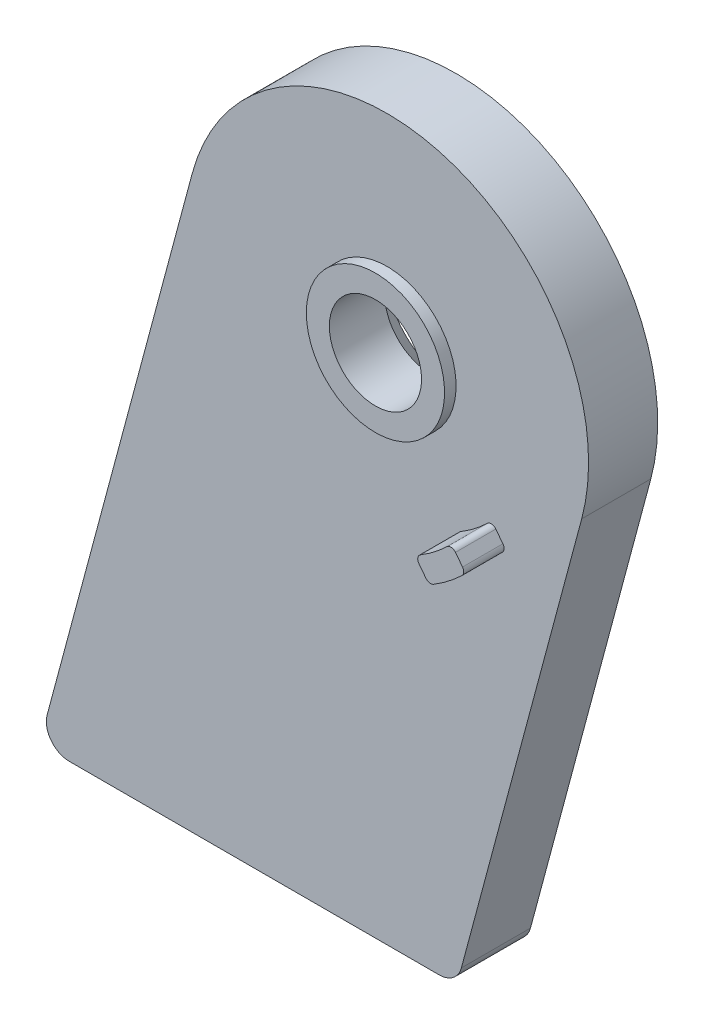
ISO-10303-21;
HEADER;
FILE_DESCRIPTION(('STEP AP214'),'2;1');
FILE_NAME('part.step','',(''),(''),'','','');
FILE_SCHEMA(('AUTOMOTIVE_DESIGN { 1 0 10303 214 1 1 1 1 }'));
ENDSEC;
DATA;
#1=APPLICATION_CONTEXT('core data for automotive mechanical design processes');
#2=APPLICATION_PROTOCOL_DEFINITION('international standard','automotive_design',2000,#1);
#3=PRODUCT_CONTEXT('',#1,'mechanical');
#4=PRODUCT('Part','Part','',(#3));
#5=PRODUCT_RELATED_PRODUCT_CATEGORY('part','',(#4));
#6=PRODUCT_DEFINITION_FORMATION('','',#4);
#7=PRODUCT_DEFINITION_CONTEXT('part definition',#1,'design');
#8=PRODUCT_DEFINITION('design','',#6,#7);
#9=PRODUCT_DEFINITION_SHAPE('','',#8);
#10=(LENGTH_UNIT() NAMED_UNIT(*) SI_UNIT(.MILLI.,.METRE.));
#11=(NAMED_UNIT(*) PLANE_ANGLE_UNIT() SI_UNIT($,.RADIAN.));
#12=(NAMED_UNIT(*) SI_UNIT($,.STERADIAN.) SOLID_ANGLE_UNIT());
#13=UNCERTAINTY_MEASURE_WITH_UNIT(LENGTH_MEASURE(1.E-05),#10,'distance_accuracy_value','');
#14=(GEOMETRIC_REPRESENTATION_CONTEXT(3) GLOBAL_UNCERTAINTY_ASSIGNED_CONTEXT((#13)) GLOBAL_UNIT_ASSIGNED_CONTEXT((#10,
#11,#12)) REPRESENTATION_CONTEXT('',''));
#15=CARTESIAN_POINT('',(0.,0.,0.));
#16=DIRECTION('',(0.,0.,1.));
#17=DIRECTION('',(1.,0.,0.));
#18=AXIS2_PLACEMENT_3D('',#15,#16,#17);
#19=CARTESIAN_POINT('',(46.,0.,-29.));
#20=DIRECTION('',(0.,0.,1.));
#21=DIRECTION('',(-1.,0.,0.));
#22=AXIS2_PLACEMENT_3D('',#19,#20,#21);
#23=PLANE('',#22);
#24=DIRECTION('',(0.258819045102514,0.96592582628907,0.));
#25=VECTOR('',#24,1.);
#26=CARTESIAN_POINT('',(58.0596194977762,-45.,-29.));
#27=LINE('',#26,#25);
#28=CARTESIAN_POINT('',(58.4568171743964,-43.517638090205,-29.));
#29=VERTEX_POINT('',#28);
#30=CARTESIAN_POINT('',(68.9037019600587,-4.529333289294,-29.));
#31=VERTEX_POINT('',#30);
#32=EDGE_CURVE('E263',#29,#31,#27,.T.);
#33=ORIENTED_EDGE('',*,*,#32,.T.);
#34=CARTESIAN_POINT('',(52.,0.,-29.));
#35=DIRECTION('',(0.,0.,-1.));
#36=DIRECTION('',(-1.,0.,0.));
#37=AXIS2_PLACEMENT_3D('',#34,#35,#36);
#38=CIRCLE('',#37,17.5);
#39=CARTESIAN_POINT('',(35.0962980399413,4.529333289294,-29.));
#40=VERTEX_POINT('',#39);
#41=EDGE_CURVE('E169',#40,#31,#38,.T.);
#42=ORIENTED_EDGE('',*,*,#41,.F.);
#43=DIRECTION('',(-0.258819045102514,-0.96592582628907,0.));
#44=VECTOR('',#43,1.);
#45=CARTESIAN_POINT('',(35.0962980399413,4.529333289294,-29.));
#46=LINE('',#45,#44);
#47=CARTESIAN_POINT('',(22.4995522765276,-42.482361909795,-29.));
#48=VERTEX_POINT('',#47);
#49=EDGE_CURVE('E162',#40,#48,#46,.T.);
#50=ORIENTED_EDGE('',*,*,#49,.T.);
#51=CARTESIAN_POINT('',(24.4314039291058,-43.,-29.));
#52=DIRECTION('',(0.,0.,-1.));
#53=DIRECTION('',(-1.,0.,0.));
#54=AXIS2_PLACEMENT_3D('',#51,#52,#53);
#55=CIRCLE('',#54,2.);
#56=CARTESIAN_POINT('',(24.4314039291058,-45.,-29.));
#57=VERTEX_POINT('',#56);
#58=EDGE_CURVE('E193',#57,#48,#55,.T.);
#59=ORIENTED_EDGE('',*,*,#58,.F.);
#60=DIRECTION('',(1.,0.,0.));
#61=VECTOR('',#60,1.);
#62=CARTESIAN_POINT('',(21.8249531834234,-45.,-29.));
#63=LINE('',#62,#61);
#64=CARTESIAN_POINT('',(56.5249655218183,-45.,-29.));
#65=VERTEX_POINT('',#64);
#66=EDGE_CURVE('E259',#57,#65,#63,.T.);
#67=ORIENTED_EDGE('',*,*,#66,.T.);
#68=CARTESIAN_POINT('',(56.5249655218183,-43.,-29.));
#69=DIRECTION('',(0.,0.,-1.));
#70=DIRECTION('',(-1.,0.,0.));
#71=AXIS2_PLACEMENT_3D('',#68,#69,#70);
#72=CIRCLE('',#71,2.);
#73=EDGE_CURVE('E196',#29,#65,#72,.T.);
#74=ORIENTED_EDGE('',*,*,#73,.F.);
#75=EDGE_LOOP('',(#33,#42,#50,#59,#67,#74));
#76=FACE_BOUND('',#75,.T.);
#77=CARTESIAN_POINT('',(52.,0.,-29.));
#78=DIRECTION('',(0.,0.,-1.));
#79=DIRECTION('',(-1.,0.,0.));
#80=AXIS2_PLACEMENT_3D('',#77,#78,#79);
#81=CIRCLE('',#80,6.);
#82=CARTESIAN_POINT('',(46.,0.,-29.));
#83=VERTEX_POINT('',#82);
#84=EDGE_CURVE('E171',#83,#83,#81,.T.);
#85=ORIENTED_EDGE('',*,*,#84,.T.);
#86=EDGE_LOOP('',(#85));
#87=FACE_BOUND('',#86,.T.);
#88=DIRECTION('',(-0.608761429008721,0.793353340291235,0.));
#89=VECTOR('',#88,1.);
#90=CARTESIAN_POINT('',(59.1559637337589,-12.6111927683755,-29.));
#91=LINE('',#90,#89);
#92=CARTESIAN_POINT('',(58.886893794168,-12.2605339960318,-29.));
#93=VERTEX_POINT('',#92);
#94=CARTESIAN_POINT('',(58.2743340974936,-11.4622306569458,-29.));
#95=VERTEX_POINT('',#94);
#96=EDGE_CURVE('E244',#93,#95,#91,.T.);
#97=ORIENTED_EDGE('',*,*,#96,.T.);
#98=CARTESIAN_POINT('',(58.6710107676392,-11.1578499424415,-29.));
#99=DIRECTION('',(0.,0.,-1.));
#100=DIRECTION('',(-1.,0.,0.));
#101=AXIS2_PLACEMENT_3D('',#98,#99,#100);
#102=CIRCLE('',#101,0.5);
#103=CARTESIAN_POINT('',(58.4144334304223,-10.7287018677322,-29.));
#104=VERTEX_POINT('',#103);
#105=EDGE_CURVE('E229',#104,#95,#102,.F.);
#106=ORIENTED_EDGE('',*,*,#105,.F.);
#107=CARTESIAN_POINT('',(52.,0.,-29.));
#108=DIRECTION('',(0.,0.,1.));
#109=DIRECTION('',(-1.,0.,0.));
#110=AXIS2_PLACEMENT_3D('',#107,#108,#109);
#111=CIRCLE('',#110,12.5);
#112=CARTESIAN_POINT('',(60.7029526812625,-8.97265928405315,-29.));
#113=VERTEX_POINT('',#112);
#114=EDGE_CURVE('E239',#104,#113,#111,.T.);
#115=ORIENTED_EDGE('',*,*,#114,.T.);
#116=CARTESIAN_POINT('',(61.051070788513,-9.33156565541528,-29.));
#117=DIRECTION('',(0.,0.,-1.));
#118=DIRECTION('',(-1.,0.,0.));
#119=AXIS2_PLACEMENT_3D('',#116,#117,#118);
#120=CIRCLE('',#119,0.5);
#121=CARTESIAN_POINT('',(61.4477474586586,-9.02718494091091,-29.));
#122=VERTEX_POINT('',#121);
#123=EDGE_CURVE('E49',#122,#113,#120,.F.);
#124=ORIENTED_EDGE('',*,*,#123,.F.);
#125=DIRECTION('',(0.60876142900872,-0.793353340291236,0.));
#126=VECTOR('',#125,1.);
#127=CARTESIAN_POINT('',(62.3293770949239,-10.1761470523406,-29.));
#128=LINE('',#127,#126);
#129=CARTESIAN_POINT('',(62.060307155333,-9.82548827999686,-29.));
#130=VERTEX_POINT('',#129);
#131=EDGE_CURVE('E243',#122,#130,#128,.T.);
#132=ORIENTED_EDGE('',*,*,#131,.T.);
#133=CARTESIAN_POINT('',(61.6636304851874,-10.1298689945012,-29.));
#134=DIRECTION('',(0.,0.,-1.));
#135=DIRECTION('',(-1.,0.,0.));
#136=AXIS2_PLACEMENT_3D('',#133,#134,#135);
#137=CIRCLE('',#136,0.5);
#138=CARTESIAN_POINT('',(62.0087601453727,-10.4916500300191,-29.));
#139=VERTEX_POINT('',#138);
#140=EDGE_CURVE('E11',#139,#130,#137,.F.);
#141=ORIENTED_EDGE('',*,*,#140,.F.);
#142=CARTESIAN_POINT('',(52.,0.,-29.));
#143=DIRECTION('',(0.,0.,-1.));
#144=DIRECTION('',(-1.,0.,0.));
#145=AXIS2_PLACEMENT_3D('',#142,#143,#144);
#146=CIRCLE('',#145,14.5);
#147=CARTESIAN_POINT('',(59.5436979808962,-12.3831587558677,-29.));
#148=VERTEX_POINT('',#147);
#149=EDGE_CURVE('E248',#139,#148,#146,.T.);
#150=ORIENTED_EDGE('',*,*,#149,.T.);
#151=CARTESIAN_POINT('',(59.2835704643136,-11.9561532815274,-29.));
#152=DIRECTION('',(0.,0.,-1.));
#153=DIRECTION('',(-1.,0.,0.));
#154=AXIS2_PLACEMENT_3D('',#151,#152,#153);
#155=CIRCLE('',#154,0.5);
#156=EDGE_CURVE('E226',#93,#148,#155,.F.);
#157=ORIENTED_EDGE('',*,*,#156,.F.);
#158=EDGE_LOOP('',(#97,#106,#115,#124,#132,#141,#150,#157));
#159=FACE_BOUND('',#158,.T.);
#160=ADVANCED_FACE('F41',(#76,#87,#159),#23,.T.);
#161=CARTESIAN_POINT('',(52.,0.,-29.));
#162=DIRECTION('',(0.,0.,1.));
#163=DIRECTION('',(-1.,0.,0.));
#164=AXIS2_PLACEMENT_3D('',#161,#162,#163);
#165=CYLINDRICAL_SURFACE('',#164,17.5);
#166=ORIENTED_EDGE('',*,*,#41,.T.);
#167=DIRECTION('',(0.,0.,-1.));
#168=VECTOR('',#167,1.);
#169=CARTESIAN_POINT('',(68.9037019600587,-4.529333289294,-29.));
#170=LINE('',#169,#168);
#171=CARTESIAN_POINT('',(68.9037019600587,-4.529333289294,-35.));
#172=VERTEX_POINT('',#171);
#173=EDGE_CURVE('E166',#31,#172,#170,.T.);
#174=ORIENTED_EDGE('',*,*,#173,.T.);
#175=CARTESIAN_POINT('',(52.,0.,-35.));
#176=DIRECTION('',(0.,0.,-1.));
#177=DIRECTION('',(-1.,0.,0.));
#178=AXIS2_PLACEMENT_3D('',#175,#176,#177);
#179=CIRCLE('',#178,17.5);
#180=CARTESIAN_POINT('',(35.0962980399413,4.529333289294,-35.));
#181=VERTEX_POINT('',#180);
#182=EDGE_CURVE('E150',#181,#172,#179,.T.);
#183=ORIENTED_EDGE('',*,*,#182,.F.);
#184=DIRECTION('',(0.,0.,-1.));
#185=VECTOR('',#184,1.);
#186=CARTESIAN_POINT('',(35.0962980399413,4.529333289294,-29.));
#187=LINE('',#186,#185);
#188=EDGE_CURVE('E159',#40,#181,#187,.T.);
#189=ORIENTED_EDGE('',*,*,#188,.F.);
#190=EDGE_LOOP('',(#166,#174,#183,#189));
#191=FACE_BOUND('',#190,.T.);
#192=ADVANCED_FACE('F168',(#191),#165,.T.);
#193=CARTESIAN_POINT('',(48.,0.,-28.));
#194=DIRECTION('',(0.,0.,1.));
#195=DIRECTION('',(-1.,0.,0.));
#196=AXIS2_PLACEMENT_3D('',#193,#194,#195);
#197=PLANE('',#196);
#198=CARTESIAN_POINT('',(52.,0.,-28.));
#199=DIRECTION('',(0.,0.,-1.));
#200=DIRECTION('',(-1.,0.,0.));
#201=AXIS2_PLACEMENT_3D('',#198,#199,#200);
#202=CIRCLE('',#201,6.);
#203=CARTESIAN_POINT('',(46.,0.,-28.));
#204=VERTEX_POINT('',#203);
#205=EDGE_CURVE('E177',#204,#204,#202,.T.);
#206=ORIENTED_EDGE('',*,*,#205,.F.);
#207=EDGE_LOOP('',(#206));
#208=FACE_BOUND('',#207,.T.);
#209=CARTESIAN_POINT('',(52.,0.,-28.));
#210=DIRECTION('',(0.,0.,-1.));
#211=DIRECTION('',(-1.,0.,0.));
#212=AXIS2_PLACEMENT_3D('',#209,#210,#211);
#213=CIRCLE('',#212,3.99999999999999);
#214=CARTESIAN_POINT('',(48.,0.,-28.));
#215=VERTEX_POINT('',#214);
#216=EDGE_CURVE('E180',#215,#215,#213,.T.);
#217=ORIENTED_EDGE('',*,*,#216,.T.);
#218=EDGE_LOOP('',(#217));
#219=FACE_BOUND('',#218,.T.);
#220=ADVANCED_FACE('F298',(#208,#219),#197,.T.);
#221=CARTESIAN_POINT('',(52.,0.,-29.));
#222=DIRECTION('',(0.,0.,1.));
#223=DIRECTION('',(-1.,0.,0.));
#224=AXIS2_PLACEMENT_3D('',#221,#222,#223);
#225=CYLINDRICAL_SURFACE('',#224,6.);
#226=ORIENTED_EDGE('',*,*,#84,.F.);
#227=EDGE_LOOP('',(#226));
#228=FACE_BOUND('',#227,.T.);
#229=ORIENTED_EDGE('',*,*,#205,.T.);
#230=EDGE_LOOP('',(#229));
#231=FACE_BOUND('',#230,.T.);
#232=ADVANCED_FACE('F302',(#228,#231),#225,.T.);
#233=CARTESIAN_POINT('',(34.5,0.,-35.));
#234=DIRECTION('',(0.,0.,-1.));
#235=DIRECTION('',(1.,0.,0.));
#236=AXIS2_PLACEMENT_3D('',#233,#234,#235);
#237=PLANE('',#236);
#238=CARTESIAN_POINT('',(52.,0.,-35.));
#239=DIRECTION('',(0.,0.,1.));
#240=DIRECTION('',(1.,0.,0.));
#241=AXIS2_PLACEMENT_3D('',#238,#239,#240);
#242=CIRCLE('',#241,6.2);
#243=CARTESIAN_POINT('',(58.2,0.,-35.));
#244=VERTEX_POINT('',#243);
#245=EDGE_CURVE('E252',#244,#244,#242,.T.);
#246=ORIENTED_EDGE('',*,*,#245,.T.);
#247=EDGE_LOOP('',(#246));
#248=FACE_BOUND('',#247,.T.);
#249=DIRECTION('',(1.,0.,0.));
#250=VECTOR('',#249,1.);
#251=CARTESIAN_POINT('',(21.8249531834234,-45.,-35.));
#252=LINE('',#251,#250);
#253=CARTESIAN_POINT('',(24.4314039291058,-45.,-35.));
#254=VERTEX_POINT('',#253);
#255=CARTESIAN_POINT('',(56.5249655218183,-45.,-35.));
#256=VERTEX_POINT('',#255);
#257=EDGE_CURVE('E155',#254,#256,#252,.T.);
#258=ORIENTED_EDGE('',*,*,#257,.F.);
#259=CARTESIAN_POINT('',(24.4314039291058,-43.,-35.));
#260=DIRECTION('',(0.,0.,1.));
#261=DIRECTION('',(1.,0.,0.));
#262=AXIS2_PLACEMENT_3D('',#259,#260,#261);
#263=CIRCLE('',#262,2.);
#264=CARTESIAN_POINT('',(22.4995522765276,-42.482361909795,-35.));
#265=VERTEX_POINT('',#264);
#266=EDGE_CURVE('E153',#265,#254,#263,.T.);
#267=ORIENTED_EDGE('',*,*,#266,.F.);
#268=DIRECTION('',(-0.258819045102514,-0.96592582628907,0.));
#269=VECTOR('',#268,1.);
#270=CARTESIAN_POINT('',(35.0962980399413,4.529333289294,-35.));
#271=LINE('',#270,#269);
#272=EDGE_CURVE('E144',#181,#265,#271,.T.);
#273=ORIENTED_EDGE('',*,*,#272,.F.);
#274=ORIENTED_EDGE('',*,*,#182,.T.);
#275=DIRECTION('',(0.258819045102514,0.96592582628907,0.));
#276=VECTOR('',#275,1.);
#277=CARTESIAN_POINT('',(58.0596194977762,-45.,-35.));
#278=LINE('',#277,#276);
#279=CARTESIAN_POINT('',(58.4568171743964,-43.517638090205,-35.));
#280=VERTEX_POINT('',#279);
#281=EDGE_CURVE('E260',#280,#172,#278,.T.);
#282=ORIENTED_EDGE('',*,*,#281,.F.);
#283=CARTESIAN_POINT('',(56.5249655218183,-43.,-35.));
#284=DIRECTION('',(0.,0.,1.));
#285=DIRECTION('',(1.,0.,0.));
#286=AXIS2_PLACEMENT_3D('',#283,#284,#285);
#287=CIRCLE('',#286,2.);
#288=EDGE_CURVE('E188',#256,#280,#287,.T.);
#289=ORIENTED_EDGE('',*,*,#288,.F.);
#290=EDGE_LOOP('',(#258,#267,#273,#274,#282,#289));
#291=FACE_BOUND('',#290,.T.);
#292=ADVANCED_FACE('F147',(#248,#291),#237,.T.);
#293=CARTESIAN_POINT('',(52.,0.,-29.));
#294=DIRECTION('',(0.,0.,1.));
#295=DIRECTION('',(-1.,0.,0.));
#296=AXIS2_PLACEMENT_3D('',#293,#294,#295);
#297=CYLINDRICAL_SURFACE('',#296,3.99999999999999);
#298=CARTESIAN_POINT('',(52.,0.,-32.8));
#299=DIRECTION('',(0.,0.,1.));
#300=DIRECTION('',(1.,0.,0.));
#301=AXIS2_PLACEMENT_3D('',#298,#299,#300);
#302=CIRCLE('',#301,3.99999999999999);
#303=CARTESIAN_POINT('',(56.,0.,-32.8));
#304=VERTEX_POINT('',#303);
#305=EDGE_CURVE('E156',#304,#304,#302,.F.);
#306=ORIENTED_EDGE('',*,*,#305,.T.);
#307=EDGE_LOOP('',(#306));
#308=FACE_BOUND('',#307,.T.);
#309=ORIENTED_EDGE('',*,*,#216,.F.);
#310=EDGE_LOOP('',(#309));
#311=FACE_BOUND('',#310,.T.);
#312=ADVANCED_FACE('F313',(#308,#311),#297,.F.);
#313=CARTESIAN_POINT('',(35.0962980399413,4.529333289294,-29.));
#314=DIRECTION('',(-0.96592582628907,0.258819045102514,0.));
#315=DIRECTION('',(-0.258819045102514,-0.96592582628907,0.));
#316=AXIS2_PLACEMENT_3D('',#313,#314,#315);
#317=PLANE('',#316);
#318=ORIENTED_EDGE('',*,*,#49,.F.);
#319=ORIENTED_EDGE('',*,*,#188,.T.);
#320=ORIENTED_EDGE('',*,*,#272,.T.);
#321=DIRECTION('',(0.,0.,-1.));
#322=VECTOR('',#321,1.);
#323=CARTESIAN_POINT('',(22.4995522765276,-42.482361909795,-29.));
#324=LINE('',#323,#322);
#325=EDGE_CURVE('E199',#48,#265,#324,.T.);
#326=ORIENTED_EDGE('',*,*,#325,.F.);
#327=EDGE_LOOP('',(#318,#319,#320,#326));
#328=FACE_BOUND('',#327,.T.);
#329=ADVANCED_FACE('F160',(#328),#317,.T.);
#330=CARTESIAN_POINT('',(58.0596194977762,-45.,-29.));
#331=DIRECTION('',(0.96592582628907,-0.258819045102514,0.));
#332=DIRECTION('',(0.258819045102514,0.96592582628907,0.));
#333=AXIS2_PLACEMENT_3D('',#330,#331,#332);
#334=PLANE('',#333);
#335=ORIENTED_EDGE('',*,*,#281,.T.);
#336=ORIENTED_EDGE('',*,*,#173,.F.);
#337=ORIENTED_EDGE('',*,*,#32,.F.);
#338=DIRECTION('',(0.,0.,-1.));
#339=VECTOR('',#338,1.);
#340=CARTESIAN_POINT('',(58.4568171743964,-43.517638090205,-29.));
#341=LINE('',#340,#339);
#342=EDGE_CURVE('E191',#280,#29,#341,.F.);
#343=ORIENTED_EDGE('',*,*,#342,.F.);
#344=EDGE_LOOP('',(#335,#336,#337,#343));
#345=FACE_BOUND('',#344,.T.);
#346=ADVANCED_FACE('F269',(#345),#334,.T.);
#347=CARTESIAN_POINT('',(21.8249531834234,-45.,-29.));
#348=DIRECTION('',(0.,-1.,0.));
#349=DIRECTION('',(0.,0.,1.));
#350=AXIS2_PLACEMENT_3D('',#347,#348,#349);
#351=PLANE('',#350);
#352=ORIENTED_EDGE('',*,*,#66,.F.);
#353=DIRECTION('',(0.,0.,-1.));
#354=VECTOR('',#353,1.);
#355=CARTESIAN_POINT('',(24.4314039291058,-45.,-29.));
#356=LINE('',#355,#354);
#357=EDGE_CURVE('E183',#254,#57,#356,.F.);
#358=ORIENTED_EDGE('',*,*,#357,.F.);
#359=ORIENTED_EDGE('',*,*,#257,.T.);
#360=DIRECTION('',(0.,0.,-1.));
#361=VECTOR('',#360,1.);
#362=CARTESIAN_POINT('',(56.5249655218183,-45.,-29.));
#363=LINE('',#362,#361);
#364=EDGE_CURVE('E185',#65,#256,#363,.T.);
#365=ORIENTED_EDGE('',*,*,#364,.F.);
#366=EDGE_LOOP('',(#352,#358,#359,#365));
#367=FACE_BOUND('',#366,.T.);
#368=ADVANCED_FACE('F275',(#367),#351,.T.);
#369=CARTESIAN_POINT('',(56.5249655218183,-43.,-29.));
#370=DIRECTION('',(0.,0.,-1.));
#371=DIRECTION('',(1.,0.,0.));
#372=AXIS2_PLACEMENT_3D('',#369,#370,#371);
#373=CYLINDRICAL_SURFACE('',#372,2.);
#374=ORIENTED_EDGE('',*,*,#73,.T.);
#375=ORIENTED_EDGE('',*,*,#364,.T.);
#376=ORIENTED_EDGE('',*,*,#288,.T.);
#377=ORIENTED_EDGE('',*,*,#342,.T.);
#378=EDGE_LOOP('',(#374,#375,#376,#377));
#379=FACE_BOUND('',#378,.T.);
#380=ADVANCED_FACE('F282',(#379),#373,.T.);
#381=CARTESIAN_POINT('',(24.4314039291058,-43.,-29.));
#382=DIRECTION('',(0.,0.,-1.));
#383=DIRECTION('',(1.,0.,0.));
#384=AXIS2_PLACEMENT_3D('',#381,#382,#383);
#385=CYLINDRICAL_SURFACE('',#384,2.);
#386=ORIENTED_EDGE('',*,*,#58,.T.);
#387=ORIENTED_EDGE('',*,*,#325,.T.);
#388=ORIENTED_EDGE('',*,*,#266,.T.);
#389=ORIENTED_EDGE('',*,*,#357,.T.);
#390=EDGE_LOOP('',(#386,#387,#388,#389));
#391=FACE_BOUND('',#390,.T.);
#392=ADVANCED_FACE('F278',(#391),#385,.T.);
#393=CARTESIAN_POINT('',(52.,0.,-35.));
#394=DIRECTION('',(0.,0.,-1.));
#395=DIRECTION('',(1.,0.,0.));
#396=AXIS2_PLACEMENT_3D('',#393,#394,#395);
#397=CONICAL_SURFACE('',#396,6.2,0.785398163397448);
#398=ORIENTED_EDGE('',*,*,#305,.F.);
#399=EDGE_LOOP('',(#398));
#400=FACE_BOUND('',#399,.T.);
#401=ORIENTED_EDGE('',*,*,#245,.F.);
#402=EDGE_LOOP('',(#401));
#403=FACE_BOUND('',#402,.T.);
#404=ADVANCED_FACE('F289',(#400,#403),#397,.F.);
#405=CARTESIAN_POINT('',(52.,0.,-25.5));
#406=DIRECTION('',(0.,0.,-1.));
#407=DIRECTION('',(1.,0.,0.));
#408=AXIS2_PLACEMENT_3D('',#405,#406,#407);
#409=CYLINDRICAL_SURFACE('',#408,14.5);
#410=ORIENTED_EDGE('',*,*,#149,.F.);
#411=DIRECTION('',(0.,0.,-1.));
#412=VECTOR('',#411,1.);
#413=CARTESIAN_POINT('',(62.0087601453727,-10.4916500300191,-25.5));
#414=LINE('',#413,#412);
#415=CARTESIAN_POINT('',(62.0087601453726,-10.4916500300191,-25.5));
#416=VERTEX_POINT('',#415);
#417=EDGE_CURVE('E206',#416,#139,#414,.T.);
#418=ORIENTED_EDGE('',*,*,#417,.F.);
#419=CARTESIAN_POINT('',(52.,0.,-25.5));
#420=DIRECTION('',(0.,0.,-1.));
#421=DIRECTION('',(-1.,0.,0.));
#422=AXIS2_PLACEMENT_3D('',#419,#420,#421);
#423=CIRCLE('',#422,14.5);
#424=CARTESIAN_POINT('',(59.5436979808962,-12.3831587558677,-25.5));
#425=VERTEX_POINT('',#424);
#426=EDGE_CURVE('E246',#416,#425,#423,.T.);
#427=ORIENTED_EDGE('',*,*,#426,.T.);
#428=DIRECTION('',(0.,0.,-1.));
#429=VECTOR('',#428,1.);
#430=CARTESIAN_POINT('',(59.5436979808962,-12.3831587558677,-25.5));
#431=LINE('',#430,#429);
#432=EDGE_CURVE('E208',#148,#425,#431,.F.);
#433=ORIENTED_EDGE('',*,*,#432,.F.);
#434=EDGE_LOOP('',(#410,#418,#427,#433));
#435=FACE_BOUND('',#434,.T.);
#436=ADVANCED_FACE('F328',(#435),#409,.T.);
#437=CARTESIAN_POINT('',(59.1559637337589,-12.6111927683755,-25.5));
#438=DIRECTION('',(0.793353340291235,0.608761429008721,0.));
#439=DIRECTION('',(-0.608761429008721,0.793353340291235,0.));
#440=AXIS2_PLACEMENT_3D('',#437,#438,#439);
#441=PLANE('',#440);
#442=DIRECTION('',(-0.608761429008721,0.793353340291235,0.));
#443=VECTOR('',#442,1.);
#444=CARTESIAN_POINT('',(59.1559637337589,-12.6111927683755,-25.5));
#445=LINE('',#444,#443);
#446=CARTESIAN_POINT('',(58.886893794168,-12.2605339960318,-25.5));
#447=VERTEX_POINT('',#446);
#448=CARTESIAN_POINT('',(58.2743340974936,-11.4622306569458,-25.5));
#449=VERTEX_POINT('',#448);
#450=EDGE_CURVE('E358',#447,#449,#445,.T.);
#451=ORIENTED_EDGE('',*,*,#450,.T.);
#452=DIRECTION('',(0.,0.,-1.));
#453=VECTOR('',#452,1.);
#454=CARTESIAN_POINT('',(58.2743340974936,-11.4622306569458,-25.5));
#455=LINE('',#454,#453);
#456=EDGE_CURVE('E201',#95,#449,#455,.F.);
#457=ORIENTED_EDGE('',*,*,#456,.F.);
#458=ORIENTED_EDGE('',*,*,#96,.F.);
#459=DIRECTION('',(0.,0.,-1.));
#460=VECTOR('',#459,1.);
#461=CARTESIAN_POINT('',(58.886893794168,-12.2605339960318,-25.5));
#462=LINE('',#461,#460);
#463=EDGE_CURVE('E204',#447,#93,#462,.T.);
#464=ORIENTED_EDGE('',*,*,#463,.F.);
#465=EDGE_LOOP('',(#451,#457,#458,#464));
#466=FACE_BOUND('',#465,.T.);
#467=ADVANCED_FACE('F332',(#466),#441,.F.);
#468=CARTESIAN_POINT('',(52.,0.,-25.5));
#469=DIRECTION('',(0.,0.,-1.));
#470=DIRECTION('',(1.,0.,0.));
#471=AXIS2_PLACEMENT_3D('',#468,#469,#470);
#472=CYLINDRICAL_SURFACE('',#471,12.5);
#473=CARTESIAN_POINT('',(52.,0.,-25.5));
#474=DIRECTION('',(0.,0.,1.));
#475=DIRECTION('',(-1.,0.,0.));
#476=AXIS2_PLACEMENT_3D('',#473,#474,#475);
#477=CIRCLE('',#476,12.5);
#478=CARTESIAN_POINT('',(58.4144334304223,-10.7287018677322,-25.5));
#479=VERTEX_POINT('',#478);
#480=CARTESIAN_POINT('',(60.7029526812625,-8.97265928405315,-25.5));
#481=VERTEX_POINT('',#480);
#482=EDGE_CURVE('E364',#479,#481,#477,.T.);
#483=ORIENTED_EDGE('',*,*,#482,.T.);
#484=DIRECTION('',(0.,0.,-1.));
#485=VECTOR('',#484,1.);
#486=CARTESIAN_POINT('',(60.7029526812625,-8.97265928405315,-25.5));
#487=LINE('',#486,#485);
#488=EDGE_CURVE('E219',#113,#481,#487,.F.);
#489=ORIENTED_EDGE('',*,*,#488,.F.);
#490=ORIENTED_EDGE('',*,*,#114,.F.);
#491=DIRECTION('',(0.,0.,-1.));
#492=VECTOR('',#491,1.);
#493=CARTESIAN_POINT('',(58.4144334304223,-10.7287018677322,-25.5));
#494=LINE('',#493,#492);
#495=EDGE_CURVE('E222',#479,#104,#494,.T.);
#496=ORIENTED_EDGE('',*,*,#495,.F.);
#497=EDGE_LOOP('',(#483,#489,#490,#496));
#498=FACE_BOUND('',#497,.T.);
#499=ADVANCED_FACE('F336',(#498),#472,.F.);
#500=CARTESIAN_POINT('',(62.3293770949239,-10.1761470523406,-25.5));
#501=DIRECTION('',(-0.793353340291236,-0.60876142900872,0.));
#502=DIRECTION('',(0.60876142900872,-0.793353340291236,0.));
#503=AXIS2_PLACEMENT_3D('',#500,#501,#502);
#504=PLANE('',#503);
#505=DIRECTION('',(0.60876142900872,-0.793353340291236,0.));
#506=VECTOR('',#505,1.);
#507=CARTESIAN_POINT('',(62.3293770949239,-10.1761470523406,-25.5));
#508=LINE('',#507,#506);
#509=CARTESIAN_POINT('',(61.4477474586586,-9.02718494091091,-25.5));
#510=VERTEX_POINT('',#509);
#511=CARTESIAN_POINT('',(62.060307155333,-9.82548827999686,-25.5));
#512=VERTEX_POINT('',#511);
#513=EDGE_CURVE('E255',#510,#512,#508,.T.);
#514=ORIENTED_EDGE('',*,*,#513,.T.);
#515=DIRECTION('',(0.,0.,-1.));
#516=VECTOR('',#515,1.);
#517=CARTESIAN_POINT('',(62.060307155333,-9.82548827999686,-25.5));
#518=LINE('',#517,#516);
#519=EDGE_CURVE('E56',#130,#512,#518,.F.);
#520=ORIENTED_EDGE('',*,*,#519,.F.);
#521=ORIENTED_EDGE('',*,*,#131,.F.);
#522=DIRECTION('',(0.,0.,-1.));
#523=VECTOR('',#522,1.);
#524=CARTESIAN_POINT('',(61.4477474586586,-9.02718494091091,-25.5));
#525=LINE('',#524,#523);
#526=EDGE_CURVE('E63',#510,#122,#525,.T.);
#527=ORIENTED_EDGE('',*,*,#526,.F.);
#528=EDGE_LOOP('',(#514,#520,#521,#527));
#529=FACE_BOUND('',#528,.T.);
#530=ADVANCED_FACE('F340',(#529),#504,.F.);
#531=CARTESIAN_POINT('',(52.,0.,-25.5));
#532=DIRECTION('',(0.,0.,1.));
#533=DIRECTION('',(-1.,0.,0.));
#534=AXIS2_PLACEMENT_3D('',#531,#532,#533);
#535=PLANE('',#534);
#536=ORIENTED_EDGE('',*,*,#426,.F.);
#537=CARTESIAN_POINT('',(61.6636304851874,-10.1298689945012,-25.5));
#538=DIRECTION('',(0.,0.,-1.));
#539=DIRECTION('',(-1.,0.,0.));
#540=AXIS2_PLACEMENT_3D('',#537,#538,#539);
#541=CIRCLE('',#540,0.5);
#542=EDGE_CURVE('E211',#512,#416,#541,.T.);
#543=ORIENTED_EDGE('',*,*,#542,.F.);
#544=ORIENTED_EDGE('',*,*,#513,.F.);
#545=CARTESIAN_POINT('',(61.051070788513,-9.33156565541528,-25.5));
#546=DIRECTION('',(0.,0.,-1.));
#547=DIRECTION('',(-1.,0.,0.));
#548=AXIS2_PLACEMENT_3D('',#545,#546,#547);
#549=CIRCLE('',#548,0.5);
#550=EDGE_CURVE('E213',#481,#510,#549,.T.);
#551=ORIENTED_EDGE('',*,*,#550,.F.);
#552=ORIENTED_EDGE('',*,*,#482,.F.);
#553=CARTESIAN_POINT('',(58.6710107676392,-11.1578499424415,-25.5));
#554=DIRECTION('',(0.,0.,-1.));
#555=DIRECTION('',(-1.,0.,0.));
#556=AXIS2_PLACEMENT_3D('',#553,#554,#555);
#557=CIRCLE('',#556,0.5);
#558=EDGE_CURVE('E215',#449,#479,#557,.T.);
#559=ORIENTED_EDGE('',*,*,#558,.F.);
#560=ORIENTED_EDGE('',*,*,#450,.F.);
#561=CARTESIAN_POINT('',(59.2835704643136,-11.9561532815274,-25.5));
#562=DIRECTION('',(0.,0.,-1.));
#563=DIRECTION('',(-1.,0.,0.));
#564=AXIS2_PLACEMENT_3D('',#561,#562,#563);
#565=CIRCLE('',#564,0.5);
#566=EDGE_CURVE('E217',#425,#447,#565,.T.);
#567=ORIENTED_EDGE('',*,*,#566,.F.);
#568=EDGE_LOOP('',(#536,#543,#544,#551,#552,#559,#560,#567));
#569=FACE_BOUND('',#568,.T.);
#570=ADVANCED_FACE('F343',(#569),#535,.T.);
#571=CARTESIAN_POINT('',(59.2835704643136,-11.9561532815274,-25.5));
#572=DIRECTION('',(0.,0.,-1.));
#573=DIRECTION('',(1.,0.,0.));
#574=AXIS2_PLACEMENT_3D('',#571,#572,#573);
#575=CYLINDRICAL_SURFACE('',#574,0.5);
#576=ORIENTED_EDGE('',*,*,#566,.T.);
#577=ORIENTED_EDGE('',*,*,#463,.T.);
#578=ORIENTED_EDGE('',*,*,#156,.T.);
#579=ORIENTED_EDGE('',*,*,#432,.T.);
#580=EDGE_LOOP('',(#576,#577,#578,#579));
#581=FACE_BOUND('',#580,.T.);
#582=ADVANCED_FACE('F345',(#581),#575,.T.);
#583=CARTESIAN_POINT('',(58.6710107676392,-11.1578499424415,-25.5));
#584=DIRECTION('',(0.,0.,-1.));
#585=DIRECTION('',(1.,0.,0.));
#586=AXIS2_PLACEMENT_3D('',#583,#584,#585);
#587=CYLINDRICAL_SURFACE('',#586,0.5);
#588=ORIENTED_EDGE('',*,*,#558,.T.);
#589=ORIENTED_EDGE('',*,*,#495,.T.);
#590=ORIENTED_EDGE('',*,*,#105,.T.);
#591=ORIENTED_EDGE('',*,*,#456,.T.);
#592=EDGE_LOOP('',(#588,#589,#590,#591));
#593=FACE_BOUND('',#592,.T.);
#594=ADVANCED_FACE('F350',(#593),#587,.T.);
#595=CARTESIAN_POINT('',(61.051070788513,-9.33156565541528,-25.5));
#596=DIRECTION('',(0.,0.,-1.));
#597=DIRECTION('',(1.,0.,0.));
#598=AXIS2_PLACEMENT_3D('',#595,#596,#597);
#599=CYLINDRICAL_SURFACE('',#598,0.5);
#600=ORIENTED_EDGE('',*,*,#550,.T.);
#601=ORIENTED_EDGE('',*,*,#526,.T.);
#602=ORIENTED_EDGE('',*,*,#123,.T.);
#603=ORIENTED_EDGE('',*,*,#488,.T.);
#604=EDGE_LOOP('',(#600,#601,#602,#603));
#605=FACE_BOUND('',#604,.T.);
#606=ADVANCED_FACE('F233',(#605),#599,.T.);
#607=CARTESIAN_POINT('',(61.6636304851874,-10.1298689945012,-25.5));
#608=DIRECTION('',(0.,0.,-1.));
#609=DIRECTION('',(1.,0.,0.));
#610=AXIS2_PLACEMENT_3D('',#607,#608,#609);
#611=CYLINDRICAL_SURFACE('',#610,0.5);
#612=ORIENTED_EDGE('',*,*,#542,.T.);
#613=ORIENTED_EDGE('',*,*,#417,.T.);
#614=ORIENTED_EDGE('',*,*,#140,.T.);
#615=ORIENTED_EDGE('',*,*,#519,.T.);
#616=EDGE_LOOP('',(#612,#613,#614,#615));
#617=FACE_BOUND('',#616,.T.);
#618=ADVANCED_FACE('F43',(#617),#611,.T.);
#619=CLOSED_SHELL('',(#160,#192,#220,#232,#292,#312,#329,#346,#368,#380,#392,#404,#436,#467,
#499,#530,#570,#582,#594,#606,#618));
#620=MANIFOLD_SOLID_BREP('B2',#619);
#621=ADVANCED_BREP_SHAPE_REPRESENTATION('',(#18,#620),#14);
#622=SHAPE_DEFINITION_REPRESENTATION(#9,#621);
ENDSEC;
END-ISO-10303-21;
